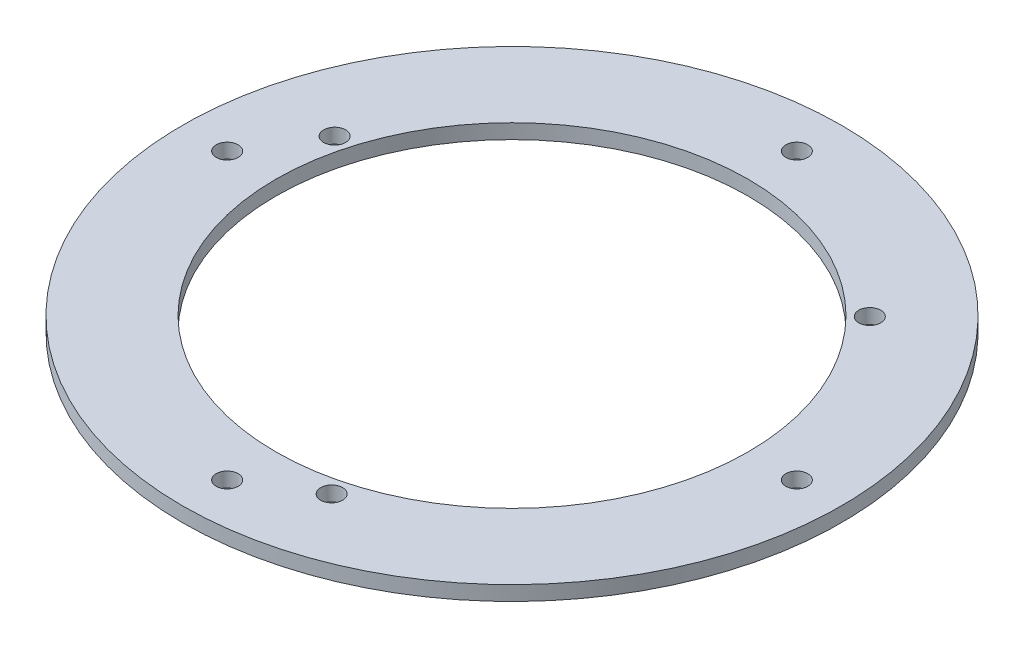
ISO-10303-21;
HEADER;
FILE_DESCRIPTION(('STEP AP214'),'2;1');
FILE_NAME('part.step','',(''),(''),'','','');
FILE_SCHEMA(('AUTOMOTIVE_DESIGN { 1 0 10303 214 1 1 1 1 }'));
ENDSEC;
DATA;
#1=APPLICATION_CONTEXT('core data for automotive mechanical design processes');
#2=APPLICATION_PROTOCOL_DEFINITION('international standard','automotive_design',2000,#1);
#3=PRODUCT_CONTEXT('',#1,'mechanical');
#4=PRODUCT('Part','Part','',(#3));
#5=PRODUCT_RELATED_PRODUCT_CATEGORY('part','',(#4));
#6=PRODUCT_DEFINITION_FORMATION('','',#4);
#7=PRODUCT_DEFINITION_CONTEXT('part definition',#1,'design');
#8=PRODUCT_DEFINITION('design','',#6,#7);
#9=PRODUCT_DEFINITION_SHAPE('','',#8);
#10=(LENGTH_UNIT() NAMED_UNIT(*) SI_UNIT(.MILLI.,.METRE.));
#11=(NAMED_UNIT(*) PLANE_ANGLE_UNIT() SI_UNIT($,.RADIAN.));
#12=(NAMED_UNIT(*) SI_UNIT($,.STERADIAN.) SOLID_ANGLE_UNIT());
#13=UNCERTAINTY_MEASURE_WITH_UNIT(LENGTH_MEASURE(1.E-05),#10,'distance_accuracy_value','');
#14=(GEOMETRIC_REPRESENTATION_CONTEXT(3) GLOBAL_UNCERTAINTY_ASSIGNED_CONTEXT((#13)) GLOBAL_UNIT_ASSIGNED_CONTEXT((#10,
#11,#12)) REPRESENTATION_CONTEXT('',''));
#15=CARTESIAN_POINT('',(0.,0.,0.));
#16=DIRECTION('',(0.,0.,1.));
#17=DIRECTION('',(1.,0.,0.));
#18=AXIS2_PLACEMENT_3D('',#15,#16,#17);
#19=CARTESIAN_POINT('',(-22.1453568798851,2.,-68.5097304670044));
#20=DIRECTION('',(0.,1.,0.));
#21=DIRECTION('',(0.,0.,1.));
#22=AXIS2_PLACEMENT_3D('',#19,#20,#21);
#23=PLANE('',#22);
#24=CARTESIAN_POINT('',(-38.8906999999989,2.,-5.41593112763317E-12));
#25=DIRECTION('',(0.,1.,0.));
#26=DIRECTION('',(0.,0.,1.));
#27=AXIS2_PLACEMENT_3D('',#24,#25,#26);
#28=CIRCLE('',#27,1.4999999999961);
#29=CARTESIAN_POINT('',(-38.8906999999989,2.,1.49999999999068));
#30=VERTEX_POINT('',#29);
#31=EDGE_CURVE('E96',#30,#30,#28,.T.);
#32=ORIENTED_EDGE('',*,*,#31,.F.);
#33=EDGE_LOOP('',(#32));
#34=FACE_BOUND('',#33,.T.);
#35=CARTESIAN_POINT('',(-2.54018371960005E-12,2.,2.39373951121069E-12));
#36=DIRECTION('',(0.,1.,0.));
#37=DIRECTION('',(0.,0.,1.));
#38=AXIS2_PLACEMENT_3D('',#35,#36,#37);
#39=CIRCLE('',#38,32.25);
#40=CARTESIAN_POINT('',(-2.54018371960005E-12,2.,32.2500000000024));
#41=VERTEX_POINT('',#40);
#42=EDGE_CURVE('E80',#41,#41,#39,.T.);
#43=ORIENTED_EDGE('',*,*,#42,.F.);
#44=EDGE_LOOP('',(#43));
#45=FACE_BOUND('',#44,.T.);
#46=CARTESIAN_POINT('',(7.07767178198537E-13,2.,-38.8906999999996));
#47=DIRECTION('',(0.,1.,0.));
#48=DIRECTION('',(0.,0.,1.));
#49=AXIS2_PLACEMENT_3D('',#46,#47,#48);
#50=CIRCLE('',#49,1.5);
#51=CARTESIAN_POINT('',(7.07767178198537E-13,2.,-37.3906999999996));
#52=VERTEX_POINT('',#51);
#53=EDGE_CURVE('E64',#52,#52,#50,.T.);
#54=ORIENTED_EDGE('',*,*,#53,.F.);
#55=EDGE_LOOP('',(#54));
#56=FACE_BOUND('',#55,.T.);
#57=CARTESIAN_POINT('',(24.5434900233458,2.,-24.3083613795366));
#58=DIRECTION('',(0.,1.,0.));
#59=DIRECTION('',(0.,0.,1.));
#60=AXIS2_PLACEMENT_3D('',#57,#58,#59);
#61=CIRCLE('',#60,1.5);
#62=CARTESIAN_POINT('',(24.5434900233458,2.,-22.8083613795366));
#63=VERTEX_POINT('',#62);
#64=EDGE_CURVE('E50',#63,#63,#61,.T.);
#65=ORIENTED_EDGE('',*,*,#64,.F.);
#66=EDGE_LOOP('',(#65));
#67=FACE_BOUND('',#66,.T.);
#68=CARTESIAN_POINT('',(-33.3234034907241,2.,-9.10110516797908));
#69=DIRECTION('',(0.,1.,0.));
#70=DIRECTION('',(0.,0.,1.));
#71=AXIS2_PLACEMENT_3D('',#68,#69,#70);
#72=CIRCLE('',#71,1.5);
#73=CARTESIAN_POINT('',(-33.3234034907241,2.,-7.60110516797907));
#74=VERTEX_POINT('',#73);
#75=EDGE_CURVE('E10',#74,#74,#72,.T.);
#76=ORIENTED_EDGE('',*,*,#75,.F.);
#77=EDGE_LOOP('',(#76));
#78=FACE_BOUND('',#77,.T.);
#79=CARTESIAN_POINT('',(8.77991346737831,2.,33.4094665475157));
#80=DIRECTION('',(0.,1.,0.));
#81=DIRECTION('',(0.,0.,1.));
#82=AXIS2_PLACEMENT_3D('',#79,#80,#81);
#83=CIRCLE('',#82,1.5);
#84=CARTESIAN_POINT('',(8.77991346737831,2.,34.9094665475157));
#85=VERTEX_POINT('',#84);
#86=EDGE_CURVE('E56',#85,#85,#83,.T.);
#87=ORIENTED_EDGE('',*,*,#86,.F.);
#88=EDGE_LOOP('',(#87));
#89=FACE_BOUND('',#88,.T.);
#90=CARTESIAN_POINT('',(38.8907000000003,2.,1.8024318858388E-12));
#91=DIRECTION('',(0.,1.,0.));
#92=DIRECTION('',(0.,0.,1.));
#93=AXIS2_PLACEMENT_3D('',#90,#91,#92);
#94=CIRCLE('',#93,1.49999999999887);
#95=CARTESIAN_POINT('',(38.8907000000003,2.,1.50000000000068));
#96=VERTEX_POINT('',#95);
#97=EDGE_CURVE('E72',#96,#96,#94,.T.);
#98=ORIENTED_EDGE('',*,*,#97,.F.);
#99=EDGE_LOOP('',(#98));
#100=FACE_BOUND('',#99,.T.);
#101=CARTESIAN_POINT('',(-2.89709659347907E-12,2.,38.8906999999996));
#102=DIRECTION('',(0.,1.,0.));
#103=DIRECTION('',(0.,0.,1.));
#104=AXIS2_PLACEMENT_3D('',#101,#102,#103);
#105=CIRCLE('',#104,1.49999999999817);
#106=CARTESIAN_POINT('',(-2.89709659347907E-12,2.,40.3906999999977));
#107=VERTEX_POINT('',#106);
#108=EDGE_CURVE('E88',#107,#107,#105,.T.);
#109=ORIENTED_EDGE('',*,*,#108,.F.);
#110=EDGE_LOOP('',(#109));
#111=FACE_BOUND('',#110,.T.);
#112=CARTESIAN_POINT('',(0.,2.,0.));
#113=DIRECTION('',(0.,1.,0.));
#114=DIRECTION('',(0.,0.,1.));
#115=AXIS2_PLACEMENT_3D('',#112,#113,#114);
#116=CIRCLE('',#115,45.);
#117=CARTESIAN_POINT('',(0.,2.,45.));
#118=VERTEX_POINT('',#117);
#119=EDGE_CURVE('E108',#118,#118,#116,.T.);
#120=ORIENTED_EDGE('',*,*,#119,.T.);
#121=EDGE_LOOP('',(#120));
#122=FACE_BOUND('',#121,.T.);
#123=ADVANCED_FACE('F37',(#34,#45,#56,#67,#78,#89,#100,#111,#122),#23,.T.);
#124=CARTESIAN_POINT('',(-22.1453568798851,0.,-68.5097304670044));
#125=DIRECTION('',(0.,1.,0.));
#126=DIRECTION('',(0.,0.,1.));
#127=AXIS2_PLACEMENT_3D('',#124,#125,#126);
#128=PLANE('',#127);
#129=CARTESIAN_POINT('',(-38.8906999999989,0.,-5.41593112763317E-12));
#130=DIRECTION('',(0.,1.,0.));
#131=DIRECTION('',(0.,0.,1.));
#132=AXIS2_PLACEMENT_3D('',#129,#130,#131);
#133=CIRCLE('',#132,1.4999999999961);
#134=CARTESIAN_POINT('',(-38.8906999999989,0.,1.49999999999068));
#135=VERTEX_POINT('',#134);
#136=EDGE_CURVE('E100',#135,#135,#133,.T.);
#137=ORIENTED_EDGE('',*,*,#136,.T.);
#138=EDGE_LOOP('',(#137));
#139=FACE_BOUND('',#138,.T.);
#140=CARTESIAN_POINT('',(-2.89709659347907E-12,0.,38.8906999999996));
#141=DIRECTION('',(0.,1.,0.));
#142=DIRECTION('',(0.,0.,1.));
#143=AXIS2_PLACEMENT_3D('',#140,#141,#142);
#144=CIRCLE('',#143,1.49999999999817);
#145=CARTESIAN_POINT('',(-2.89709659347907E-12,0.,40.3906999999977));
#146=VERTEX_POINT('',#145);
#147=EDGE_CURVE('E92',#146,#146,#144,.T.);
#148=ORIENTED_EDGE('',*,*,#147,.T.);
#149=EDGE_LOOP('',(#148));
#150=FACE_BOUND('',#149,.T.);
#151=CARTESIAN_POINT('',(-2.54018371960005E-12,0.,2.39373951121069E-12));
#152=DIRECTION('',(0.,1.,0.));
#153=DIRECTION('',(0.,0.,1.));
#154=AXIS2_PLACEMENT_3D('',#151,#152,#153);
#155=CIRCLE('',#154,32.25);
#156=CARTESIAN_POINT('',(-2.54018371960005E-12,0.,32.2500000000024));
#157=VERTEX_POINT('',#156);
#158=EDGE_CURVE('E84',#157,#157,#155,.T.);
#159=ORIENTED_EDGE('',*,*,#158,.T.);
#160=EDGE_LOOP('',(#159));
#161=FACE_BOUND('',#160,.T.);
#162=CARTESIAN_POINT('',(38.8907000000003,0.,1.8024318858388E-12));
#163=DIRECTION('',(0.,1.,0.));
#164=DIRECTION('',(0.,0.,1.));
#165=AXIS2_PLACEMENT_3D('',#162,#163,#164);
#166=CIRCLE('',#165,1.49999999999887);
#167=CARTESIAN_POINT('',(38.8907000000003,0.,1.50000000000068));
#168=VERTEX_POINT('',#167);
#169=EDGE_CURVE('E76',#168,#168,#166,.T.);
#170=ORIENTED_EDGE('',*,*,#169,.T.);
#171=EDGE_LOOP('',(#170));
#172=FACE_BOUND('',#171,.T.);
#173=CARTESIAN_POINT('',(7.07767178198537E-13,0.,-38.8906999999996));
#174=DIRECTION('',(0.,1.,0.));
#175=DIRECTION('',(0.,0.,1.));
#176=AXIS2_PLACEMENT_3D('',#173,#174,#175);
#177=CIRCLE('',#176,1.5);
#178=CARTESIAN_POINT('',(7.07767178198537E-13,0.,-37.3906999999996));
#179=VERTEX_POINT('',#178);
#180=EDGE_CURVE('E68',#179,#179,#177,.T.);
#181=ORIENTED_EDGE('',*,*,#180,.T.);
#182=EDGE_LOOP('',(#181));
#183=FACE_BOUND('',#182,.T.);
#184=CARTESIAN_POINT('',(8.77991346737831,0.,33.4094665475157));
#185=DIRECTION('',(0.,1.,0.));
#186=DIRECTION('',(0.,0.,1.));
#187=AXIS2_PLACEMENT_3D('',#184,#185,#186);
#188=CIRCLE('',#187,1.5);
#189=CARTESIAN_POINT('',(8.77991346737831,0.,34.9094665475157));
#190=VERTEX_POINT('',#189);
#191=EDGE_CURVE('E60',#190,#190,#188,.T.);
#192=ORIENTED_EDGE('',*,*,#191,.T.);
#193=EDGE_LOOP('',(#192));
#194=FACE_BOUND('',#193,.T.);
#195=CARTESIAN_POINT('',(24.5434900233458,0.,-24.3083613795366));
#196=DIRECTION('',(0.,1.,0.));
#197=DIRECTION('',(0.,0.,1.));
#198=AXIS2_PLACEMENT_3D('',#195,#196,#197);
#199=CIRCLE('',#198,1.5);
#200=CARTESIAN_POINT('',(24.5434900233458,0.,-22.8083613795366));
#201=VERTEX_POINT('',#200);
#202=EDGE_CURVE('E52',#201,#201,#199,.T.);
#203=ORIENTED_EDGE('',*,*,#202,.T.);
#204=EDGE_LOOP('',(#203));
#205=FACE_BOUND('',#204,.T.);
#206=CARTESIAN_POINT('',(-33.3234034907241,0.,-9.10110516797908));
#207=DIRECTION('',(0.,1.,0.));
#208=DIRECTION('',(0.,0.,1.));
#209=AXIS2_PLACEMENT_3D('',#206,#207,#208);
#210=CIRCLE('',#209,1.5);
#211=CARTESIAN_POINT('',(-33.3234034907241,0.,-7.60110516797907));
#212=VERTEX_POINT('',#211);
#213=EDGE_CURVE('E41',#212,#212,#210,.T.);
#214=ORIENTED_EDGE('',*,*,#213,.T.);
#215=EDGE_LOOP('',(#214));
#216=FACE_BOUND('',#215,.T.);
#217=CARTESIAN_POINT('',(0.,0.,0.));
#218=DIRECTION('',(0.,1.,0.));
#219=DIRECTION('',(0.,0.,1.));
#220=AXIS2_PLACEMENT_3D('',#217,#218,#219);
#221=CIRCLE('',#220,45.);
#222=CARTESIAN_POINT('',(0.,0.,45.));
#223=VERTEX_POINT('',#222);
#224=EDGE_CURVE('E104',#223,#223,#221,.T.);
#225=ORIENTED_EDGE('',*,*,#224,.F.);
#226=EDGE_LOOP('',(#225));
#227=FACE_BOUND('',#226,.T.);
#228=ADVANCED_FACE('F39',(#139,#150,#161,#172,#183,#194,#205,#216,#227),#128,.F.);
#229=CARTESIAN_POINT('',(-33.3234034907241,2.,-9.10110516797908));
#230=DIRECTION('',(0.,-1.,0.));
#231=DIRECTION('',(0.,0.,-1.));
#232=AXIS2_PLACEMENT_3D('',#229,#230,#231);
#233=CYLINDRICAL_SURFACE('',#232,1.5);
#234=ORIENTED_EDGE('',*,*,#75,.T.);
#235=EDGE_LOOP('',(#234));
#236=FACE_BOUND('',#235,.T.);
#237=ORIENTED_EDGE('',*,*,#213,.F.);
#238=EDGE_LOOP('',(#237));
#239=FACE_BOUND('',#238,.T.);
#240=ADVANCED_FACE('F120',(#236,#239),#233,.F.);
#241=CARTESIAN_POINT('',(24.5434900233458,2.,-24.3083613795366));
#242=DIRECTION('',(0.,-1.,0.));
#243=DIRECTION('',(0.,0.,-1.));
#244=AXIS2_PLACEMENT_3D('',#241,#242,#243);
#245=CYLINDRICAL_SURFACE('',#244,1.5);
#246=ORIENTED_EDGE('',*,*,#64,.T.);
#247=EDGE_LOOP('',(#246));
#248=FACE_BOUND('',#247,.T.);
#249=ORIENTED_EDGE('',*,*,#202,.F.);
#250=EDGE_LOOP('',(#249));
#251=FACE_BOUND('',#250,.T.);
#252=ADVANCED_FACE('F126',(#248,#251),#245,.F.);
#253=CARTESIAN_POINT('',(8.77991346737831,2.,33.4094665475157));
#254=DIRECTION('',(0.,-1.,0.));
#255=DIRECTION('',(0.,0.,-1.));
#256=AXIS2_PLACEMENT_3D('',#253,#254,#255);
#257=CYLINDRICAL_SURFACE('',#256,1.5);
#258=ORIENTED_EDGE('',*,*,#86,.T.);
#259=EDGE_LOOP('',(#258));
#260=FACE_BOUND('',#259,.T.);
#261=ORIENTED_EDGE('',*,*,#191,.F.);
#262=EDGE_LOOP('',(#261));
#263=FACE_BOUND('',#262,.T.);
#264=ADVANCED_FACE('F147',(#260,#263),#257,.F.);
#265=CARTESIAN_POINT('',(7.07767178198537E-13,2.,-38.8906999999996));
#266=DIRECTION('',(0.,-1.,0.));
#267=DIRECTION('',(0.,0.,-1.));
#268=AXIS2_PLACEMENT_3D('',#265,#266,#267);
#269=CYLINDRICAL_SURFACE('',#268,1.5);
#270=ORIENTED_EDGE('',*,*,#53,.T.);
#271=EDGE_LOOP('',(#270));
#272=FACE_BOUND('',#271,.T.);
#273=ORIENTED_EDGE('',*,*,#180,.F.);
#274=EDGE_LOOP('',(#273));
#275=FACE_BOUND('',#274,.T.);
#276=ADVANCED_FACE('F153',(#272,#275),#269,.F.);
#277=CARTESIAN_POINT('',(38.8907000000003,2.,1.8024318858388E-12));
#278=DIRECTION('',(0.,-1.,0.));
#279=DIRECTION('',(0.,0.,-1.));
#280=AXIS2_PLACEMENT_3D('',#277,#278,#279);
#281=CYLINDRICAL_SURFACE('',#280,1.49999999999887);
#282=ORIENTED_EDGE('',*,*,#97,.T.);
#283=EDGE_LOOP('',(#282));
#284=FACE_BOUND('',#283,.T.);
#285=ORIENTED_EDGE('',*,*,#169,.F.);
#286=EDGE_LOOP('',(#285));
#287=FACE_BOUND('',#286,.T.);
#288=ADVANCED_FACE('F159',(#284,#287),#281,.F.);
#289=CARTESIAN_POINT('',(-2.54018371960005E-12,2.,2.39373951121069E-12));
#290=DIRECTION('',(0.,-1.,0.));
#291=DIRECTION('',(0.,0.,-1.));
#292=AXIS2_PLACEMENT_3D('',#289,#290,#291);
#293=CYLINDRICAL_SURFACE('',#292,32.25);
#294=ORIENTED_EDGE('',*,*,#42,.T.);
#295=EDGE_LOOP('',(#294));
#296=FACE_BOUND('',#295,.T.);
#297=ORIENTED_EDGE('',*,*,#158,.F.);
#298=EDGE_LOOP('',(#297));
#299=FACE_BOUND('',#298,.T.);
#300=ADVANCED_FACE('F163',(#296,#299),#293,.F.);
#301=CARTESIAN_POINT('',(-2.89709659347907E-12,2.,38.8906999999996));
#302=DIRECTION('',(0.,-1.,0.));
#303=DIRECTION('',(0.,0.,-1.));
#304=AXIS2_PLACEMENT_3D('',#301,#302,#303);
#305=CYLINDRICAL_SURFACE('',#304,1.49999999999817);
#306=ORIENTED_EDGE('',*,*,#108,.T.);
#307=EDGE_LOOP('',(#306));
#308=FACE_BOUND('',#307,.T.);
#309=ORIENTED_EDGE('',*,*,#147,.F.);
#310=EDGE_LOOP('',(#309));
#311=FACE_BOUND('',#310,.T.);
#312=ADVANCED_FACE('F167',(#308,#311),#305,.F.);
#313=CARTESIAN_POINT('',(-38.8906999999989,2.,-5.41593112763317E-12));
#314=DIRECTION('',(0.,-1.,0.));
#315=DIRECTION('',(0.,0.,-1.));
#316=AXIS2_PLACEMENT_3D('',#313,#314,#315);
#317=CYLINDRICAL_SURFACE('',#316,1.4999999999961);
#318=ORIENTED_EDGE('',*,*,#31,.T.);
#319=EDGE_LOOP('',(#318));
#320=FACE_BOUND('',#319,.T.);
#321=ORIENTED_EDGE('',*,*,#136,.F.);
#322=EDGE_LOOP('',(#321));
#323=FACE_BOUND('',#322,.T.);
#324=ADVANCED_FACE('F171',(#320,#323),#317,.F.);
#325=CARTESIAN_POINT('',(0.,0.,0.));
#326=DIRECTION('',(0.,1.,0.));
#327=DIRECTION('',(0.,0.,1.));
#328=AXIS2_PLACEMENT_3D('',#325,#326,#327);
#329=CYLINDRICAL_SURFACE('',#328,45.);
#330=ORIENTED_EDGE('',*,*,#224,.T.);
#331=EDGE_LOOP('',(#330));
#332=FACE_BOUND('',#331,.T.);
#333=ORIENTED_EDGE('',*,*,#119,.F.);
#334=EDGE_LOOP('',(#333));
#335=FACE_BOUND('',#334,.T.);
#336=ADVANCED_FACE('F116',(#332,#335),#329,.T.);
#337=CLOSED_SHELL('',(#123,#228,#240,#252,#264,#276,#288,#300,#312,#324,#336));
#338=MANIFOLD_SOLID_BREP('B2',#337);
#339=ADVANCED_BREP_SHAPE_REPRESENTATION('',(#18,#338),#14);
#340=SHAPE_DEFINITION_REPRESENTATION(#9,#339);
ENDSEC;
END-ISO-10303-21;
